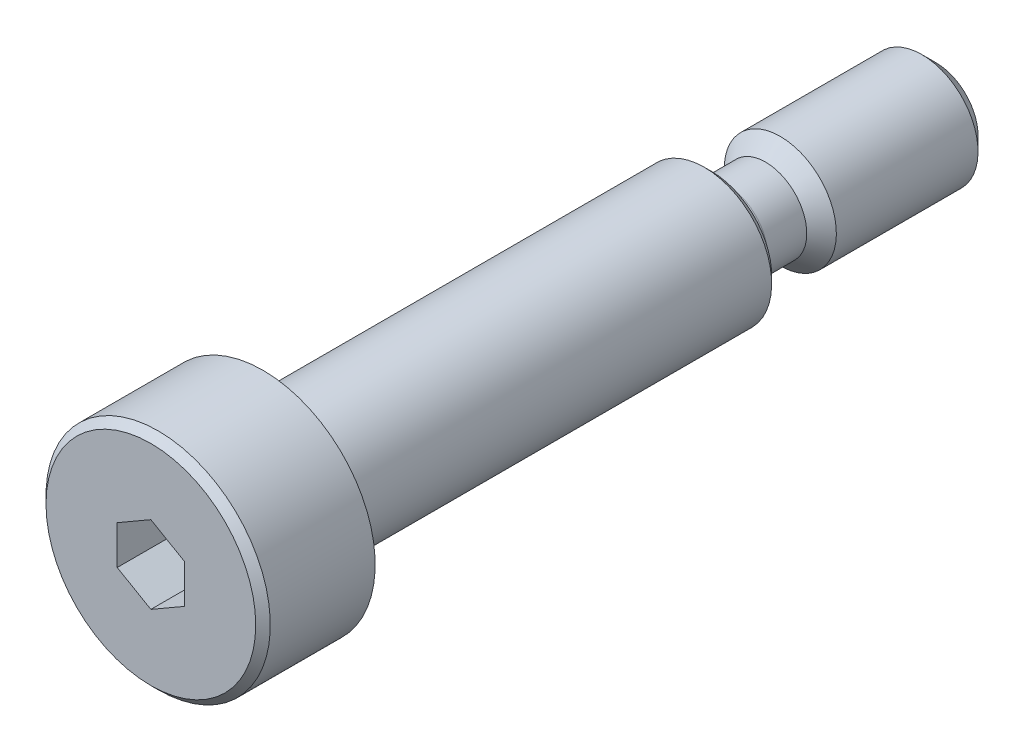
ISO-10303-21;
HEADER;
FILE_DESCRIPTION(('STEP AP214'),'2;1');
FILE_NAME('part.step','',(''),(''),'','','');
FILE_SCHEMA(('AUTOMOTIVE_DESIGN { 1 0 10303 214 1 1 1 1 }'));
ENDSEC;
DATA;
#1=APPLICATION_CONTEXT('core data for automotive mechanical design processes');
#2=APPLICATION_PROTOCOL_DEFINITION('international standard','automotive_design',2000,#1);
#3=PRODUCT_CONTEXT('',#1,'mechanical');
#4=PRODUCT('Part','Part','',(#3));
#5=PRODUCT_RELATED_PRODUCT_CATEGORY('part','',(#4));
#6=PRODUCT_DEFINITION_FORMATION('','',#4);
#7=PRODUCT_DEFINITION_CONTEXT('part definition',#1,'design');
#8=PRODUCT_DEFINITION('design','',#6,#7);
#9=PRODUCT_DEFINITION_SHAPE('','',#8);
#10=(LENGTH_UNIT() NAMED_UNIT(*) SI_UNIT(.MILLI.,.METRE.));
#11=(NAMED_UNIT(*) PLANE_ANGLE_UNIT() SI_UNIT($,.RADIAN.));
#12=(NAMED_UNIT(*) SI_UNIT($,.STERADIAN.) SOLID_ANGLE_UNIT());
#13=UNCERTAINTY_MEASURE_WITH_UNIT(LENGTH_MEASURE(1.E-05),#10,'distance_accuracy_value','');
#14=(GEOMETRIC_REPRESENTATION_CONTEXT(3) GLOBAL_UNCERTAINTY_ASSIGNED_CONTEXT((#13)) GLOBAL_UNIT_ASSIGNED_CONTEXT((#10,
#11,#12)) REPRESENTATION_CONTEXT('',''));
#15=CARTESIAN_POINT('',(0.,0.,0.));
#16=DIRECTION('',(0.,0.,1.));
#17=DIRECTION('',(1.,0.,0.));
#18=AXIS2_PLACEMENT_3D('',#15,#16,#17);
#19=CARTESIAN_POINT('',(0.,0.,-17.5));
#20=DIRECTION('',(0.,0.,-1.));
#21=DIRECTION('',(0.,1.,0.));
#22=AXIS2_PLACEMENT_3D('',#19,#20,#21);
#23=CYLINDRICAL_SURFACE('',#22,3.);
#24=CARTESIAN_POINT('',(0.,0.,-7.17500000000001));
#25=DIRECTION('',(0.,0.,-1.));
#26=DIRECTION('',(0.,1.,0.));
#27=AXIS2_PLACEMENT_3D('',#24,#25,#26);
#28=CIRCLE('',#27,3.);
#29=CARTESIAN_POINT('',(0.,3.,-7.17500000000001));
#30=VERTEX_POINT('',#29);
#31=EDGE_CURVE('E217',#30,#30,#28,.F.);
#32=ORIENTED_EDGE('',*,*,#31,.T.);
#33=EDGE_LOOP('',(#32));
#34=FACE_BOUND('',#33,.T.);
#35=CARTESIAN_POINT('',(0.,0.,11.6383333333333));
#36=DIRECTION('',(0.,0.,-1.));
#37=DIRECTION('',(0.,1.,0.));
#38=AXIS2_PLACEMENT_3D('',#35,#36,#37);
#39=CIRCLE('',#38,3.);
#40=CARTESIAN_POINT('',(0.,3.,11.6383333333333));
#41=VERTEX_POINT('',#40);
#42=EDGE_CURVE('E186',#41,#41,#39,.T.);
#43=ORIENTED_EDGE('',*,*,#42,.T.);
#44=EDGE_LOOP('',(#43));
#45=FACE_BOUND('',#44,.T.);
#46=ADVANCED_FACE('F41',(#34,#45),#23,.T.);
#47=CARTESIAN_POINT('',(0.,-3.,-7.5));
#48=DIRECTION('',(0.,0.,-1.));
#49=DIRECTION('',(0.,1.,0.));
#50=AXIS2_PLACEMENT_3D('',#47,#48,#49);
#51=PLANE('',#50);
#52=CARTESIAN_POINT('',(0.,0.,-7.5));
#53=DIRECTION('',(0.,0.,-1.));
#54=DIRECTION('',(0.,1.,0.));
#55=AXIS2_PLACEMENT_3D('',#52,#53,#54);
#56=CIRCLE('',#55,2.67500000000001);
#57=CARTESIAN_POINT('',(0.,2.67500000000001,-7.5));
#58=VERTEX_POINT('',#57);
#59=EDGE_CURVE('E213',#58,#58,#56,.T.);
#60=ORIENTED_EDGE('',*,*,#59,.T.);
#61=EDGE_LOOP('',(#60));
#62=FACE_BOUND('',#61,.T.);
#63=CARTESIAN_POINT('',(0.,0.,-7.5));
#64=DIRECTION('',(0.,0.,-1.));
#65=DIRECTION('',(0.,1.,0.));
#66=AXIS2_PLACEMENT_3D('',#63,#64,#65);
#67=CIRCLE('',#66,2.5);
#68=CARTESIAN_POINT('',(0.,2.5,-7.5));
#69=VERTEX_POINT('',#68);
#70=EDGE_CURVE('E173',#69,#69,#67,.T.);
#71=ORIENTED_EDGE('',*,*,#70,.F.);
#72=EDGE_LOOP('',(#71));
#73=FACE_BOUND('',#72,.T.);
#74=ADVANCED_FACE('F241',(#62,#73),#51,.T.);
#75=CARTESIAN_POINT('',(0.,0.,-17.5));
#76=DIRECTION('',(0.,0.,-1.));
#77=DIRECTION('',(0.,1.,0.));
#78=AXIS2_PLACEMENT_3D('',#75,#76,#77);
#79=CYLINDRICAL_SURFACE('',#78,2.33333333333333);
#80=CARTESIAN_POINT('',(0.,0.,12.0283333333333));
#81=DIRECTION('',(0.,0.,-1.));
#82=DIRECTION('',(0.,1.,0.));
#83=AXIS2_PLACEMENT_3D('',#80,#81,#82);
#84=CIRCLE('',#83,2.33333333333333);
#85=CARTESIAN_POINT('',(0.,2.33333333333333,12.0283333333333));
#86=VERTEX_POINT('',#85);
#87=EDGE_CURVE('E198',#86,#86,#84,.F.);
#88=ORIENTED_EDGE('',*,*,#87,.T.);
#89=EDGE_LOOP('',(#88));
#90=FACE_BOUND('',#89,.T.);
#91=CARTESIAN_POINT('',(0.,0.,12.5));
#92=DIRECTION('',(0.,0.,-1.));
#93=DIRECTION('',(0.,1.,0.));
#94=AXIS2_PLACEMENT_3D('',#91,#92,#93);
#95=CIRCLE('',#94,2.33333333333333);
#96=CARTESIAN_POINT('',(0.,2.33333333333333,12.5));
#97=VERTEX_POINT('',#96);
#98=EDGE_CURVE('E178',#97,#97,#95,.T.);
#99=ORIENTED_EDGE('',*,*,#98,.T.);
#100=EDGE_LOOP('',(#99));
#101=FACE_BOUND('',#100,.T.);
#102=ADVANCED_FACE('F247',(#90,#101),#79,.T.);
#103=CARTESIAN_POINT('',(0.,3.,11.8333333333333));
#104=DIRECTION('',(0.,0.,-1.));
#105=DIRECTION('',(0.,1.,0.));
#106=AXIS2_PLACEMENT_3D('',#103,#104,#105);
#107=PLANE('',#106);
#108=CARTESIAN_POINT('',(0.,0.,11.8333333333333));
#109=DIRECTION('',(0.,0.,-1.));
#110=DIRECTION('',(0.,1.,0.));
#111=AXIS2_PLACEMENT_3D('',#108,#109,#110);
#112=CIRCLE('',#111,2.805);
#113=CARTESIAN_POINT('',(0.,2.805,11.8333333333333));
#114=VERTEX_POINT('',#113);
#115=EDGE_CURVE('E194',#114,#114,#112,.F.);
#116=ORIENTED_EDGE('',*,*,#115,.T.);
#117=EDGE_LOOP('',(#116));
#118=FACE_BOUND('',#117,.T.);
#119=CARTESIAN_POINT('',(0.,0.,11.8333333333333));
#120=DIRECTION('',(0.,0.,-1.));
#121=DIRECTION('',(0.,1.,0.));
#122=AXIS2_PLACEMENT_3D('',#119,#120,#121);
#123=CIRCLE('',#122,2.52833333333334);
#124=CARTESIAN_POINT('',(0.,2.52833333333333,11.8333333333333));
#125=VERTEX_POINT('',#124);
#126=EDGE_CURVE('E190',#125,#125,#123,.T.);
#127=ORIENTED_EDGE('',*,*,#126,.T.);
#128=EDGE_LOOP('',(#127));
#129=FACE_BOUND('',#128,.T.);
#130=ADVANCED_FACE('F263',(#118,#129),#107,.F.);
#131=CARTESIAN_POINT('',(0.,0.,17.5));
#132=DIRECTION('',(0.,0.,1.));
#133=DIRECTION('',(0.,-1.,0.));
#134=AXIS2_PLACEMENT_3D('',#131,#132,#133);
#135=PLANE('',#134);
#136=DIRECTION('',(0.,1.,0.));
#137=VECTOR('',#136,1.);
#138=CARTESIAN_POINT('',(1.5,-0.866025403784444,17.5));
#139=LINE('',#138,#137);
#140=CARTESIAN_POINT('',(1.5,-0.866025403784444,17.5));
#141=VERTEX_POINT('',#140);
#142=CARTESIAN_POINT('',(1.5,0.866025403784433,17.5));
#143=VERTEX_POINT('',#142);
#144=EDGE_CURVE('E57',#141,#143,#139,.T.);
#145=ORIENTED_EDGE('',*,*,#144,.F.);
#146=DIRECTION('',(0.866025403784439,0.5,0.));
#147=VECTOR('',#146,1.);
#148=CARTESIAN_POINT('',(0.,-1.73205080756888,17.5));
#149=LINE('',#148,#147);
#150=CARTESIAN_POINT('',(0.,-1.73205080756888,17.5));
#151=VERTEX_POINT('',#150);
#152=EDGE_CURVE('E150',#151,#141,#149,.T.);
#153=ORIENTED_EDGE('',*,*,#152,.F.);
#154=DIRECTION('',(0.866025403784439,-0.5,0.));
#155=VECTOR('',#154,1.);
#156=CARTESIAN_POINT('',(-1.5,-0.866025403784444,17.5));
#157=LINE('',#156,#155);
#158=CARTESIAN_POINT('',(-1.5,-0.866025403784444,17.5));
#159=VERTEX_POINT('',#158);
#160=EDGE_CURVE('E147',#159,#151,#157,.T.);
#161=ORIENTED_EDGE('',*,*,#160,.F.);
#162=DIRECTION('',(0.,-1.,0.));
#163=VECTOR('',#162,1.);
#164=CARTESIAN_POINT('',(-1.5,0.866025403784433,17.5));
#165=LINE('',#164,#163);
#166=CARTESIAN_POINT('',(-1.5,0.866025403784433,17.5));
#167=VERTEX_POINT('',#166);
#168=EDGE_CURVE('E105',#167,#159,#165,.T.);
#169=ORIENTED_EDGE('',*,*,#168,.F.);
#170=DIRECTION('',(-0.866025403784439,-0.5,0.));
#171=VECTOR('',#170,1.);
#172=CARTESIAN_POINT('',(0.,1.73205080756887,17.5));
#173=LINE('',#172,#171);
#174=CARTESIAN_POINT('',(0.,1.73205080756887,17.5));
#175=VERTEX_POINT('',#174);
#176=EDGE_CURVE('E141',#175,#167,#173,.T.);
#177=ORIENTED_EDGE('',*,*,#176,.F.);
#178=DIRECTION('',(-0.866025403784439,0.5,0.));
#179=VECTOR('',#178,1.);
#180=CARTESIAN_POINT('',(1.5,0.866025403784434,17.5));
#181=LINE('',#180,#179);
#182=EDGE_CURVE('E137',#143,#175,#181,.T.);
#183=ORIENTED_EDGE('',*,*,#182,.F.);
#184=EDGE_LOOP('',(#145,#153,#161,#169,#177,#183));
#185=FACE_BOUND('',#184,.T.);
#186=CARTESIAN_POINT('',(0.,0.,17.5));
#187=DIRECTION('',(0.,0.,1.));
#188=DIRECTION('',(0.,-1.,0.));
#189=AXIS2_PLACEMENT_3D('',#186,#187,#188);
#190=CIRCLE('',#189,4.675);
#191=CARTESIAN_POINT('',(0.,-4.67500000000001,17.5));
#192=VERTEX_POINT('',#191);
#193=EDGE_CURVE('E11',#192,#192,#190,.T.);
#194=ORIENTED_EDGE('',*,*,#193,.T.);
#195=EDGE_LOOP('',(#194));
#196=FACE_BOUND('',#195,.T.);
#197=ADVANCED_FACE('F260',(#185,#196),#135,.T.);
#198=CARTESIAN_POINT('',(0.,0.,-17.5));
#199=DIRECTION('',(0.,0.,-1.));
#200=DIRECTION('',(0.,1.,0.));
#201=AXIS2_PLACEMENT_3D('',#198,#199,#200);
#202=CYLINDRICAL_SURFACE('',#201,5.);
#203=CARTESIAN_POINT('',(0.,0.,17.175));
#204=DIRECTION('',(0.,0.,1.));
#205=DIRECTION('',(0.,-1.,0.));
#206=AXIS2_PLACEMENT_3D('',#203,#204,#205);
#207=CIRCLE('',#206,5.);
#208=CARTESIAN_POINT('',(0.,-5.,17.175));
#209=VERTEX_POINT('',#208);
#210=EDGE_CURVE('E50',#209,#209,#207,.F.);
#211=ORIENTED_EDGE('',*,*,#210,.T.);
#212=EDGE_LOOP('',(#211));
#213=FACE_BOUND('',#212,.T.);
#214=CARTESIAN_POINT('',(0.,0.,12.5));
#215=DIRECTION('',(0.,0.,-1.));
#216=DIRECTION('',(0.,1.,0.));
#217=AXIS2_PLACEMENT_3D('',#214,#215,#216);
#218=CIRCLE('',#217,5.);
#219=CARTESIAN_POINT('',(0.,5.,12.5));
#220=VERTEX_POINT('',#219);
#221=EDGE_CURVE('E182',#220,#220,#218,.T.);
#222=ORIENTED_EDGE('',*,*,#221,.F.);
#223=EDGE_LOOP('',(#222));
#224=FACE_BOUND('',#223,.T.);
#225=ADVANCED_FACE('F224',(#213,#224),#202,.T.);
#226=CARTESIAN_POINT('',(0.,-5.,12.5));
#227=DIRECTION('',(0.,0.,-1.));
#228=DIRECTION('',(0.,1.,0.));
#229=AXIS2_PLACEMENT_3D('',#226,#227,#228);
#230=PLANE('',#229);
#231=ORIENTED_EDGE('',*,*,#221,.T.);
#232=EDGE_LOOP('',(#231));
#233=FACE_BOUND('',#232,.T.);
#234=ORIENTED_EDGE('',*,*,#98,.F.);
#235=EDGE_LOOP('',(#234));
#236=FACE_BOUND('',#235,.T.);
#237=ADVANCED_FACE('F253',(#233,#236),#230,.T.);
#238=CARTESIAN_POINT('',(0.,0.,11.6383333333333));
#239=DIRECTION('',(0.,0.,-1.));
#240=DIRECTION('',(0.,1.,0.));
#241=AXIS2_PLACEMENT_3D('',#238,#239,#240);
#242=CONICAL_SURFACE('',#241,3.,0.785398163397448);
#243=ORIENTED_EDGE('',*,*,#115,.F.);
#244=EDGE_LOOP('',(#243));
#245=FACE_BOUND('',#244,.T.);
#246=ORIENTED_EDGE('',*,*,#42,.F.);
#247=EDGE_LOOP('',(#246));
#248=FACE_BOUND('',#247,.T.);
#249=ADVANCED_FACE('F256',(#245,#248),#242,.T.);
#250=CARTESIAN_POINT('',(0.,0.,11.8333333333333));
#251=DIRECTION('',(0.,0.,-1.));
#252=DIRECTION('',(0.,1.,0.));
#253=AXIS2_PLACEMENT_3D('',#250,#251,#252);
#254=CONICAL_SURFACE('',#253,2.52833333333334,0.785398163397449);
#255=ORIENTED_EDGE('',*,*,#87,.F.);
#256=EDGE_LOOP('',(#255));
#257=FACE_BOUND('',#256,.T.);
#258=ORIENTED_EDGE('',*,*,#126,.F.);
#259=EDGE_LOOP('',(#258));
#260=FACE_BOUND('',#259,.T.);
#261=ADVANCED_FACE('F267',(#257,#260),#254,.T.);
#262=CARTESIAN_POINT('',(0.,0.,-8.16000000000001));
#263=DIRECTION('',(0.,0.,-1.));
#264=DIRECTION('',(0.,1.,0.));
#265=AXIS2_PLACEMENT_3D('',#262,#263,#264);
#266=TOROIDAL_SURFACE('',#265,2.5,0.660000000000006);
#267=CARTESIAN_POINT('',(0.,0.,-8.16));
#268=DIRECTION('',(0.,0.,-1.));
#269=DIRECTION('',(0.,1.,0.));
#270=AXIS2_PLACEMENT_3D('',#267,#268,#269);
#271=CIRCLE('',#270,1.84);
#272=CARTESIAN_POINT('',(0.,1.84,-8.16));
#273=VERTEX_POINT('',#272);
#274=EDGE_CURVE('E169',#273,#273,#271,.T.);
#275=ORIENTED_EDGE('',*,*,#274,.F.);
#276=EDGE_LOOP('',(#275));
#277=FACE_BOUND('',#276,.T.);
#278=ORIENTED_EDGE('',*,*,#70,.T.);
#279=EDGE_LOOP('',(#278));
#280=FACE_BOUND('',#279,.T.);
#281=ADVANCED_FACE('F271',(#277,#280),#266,.F.);
#282=CARTESIAN_POINT('',(0.,0.,-17.5));
#283=DIRECTION('',(0.,0.,-1.));
#284=DIRECTION('',(0.,1.,0.));
#285=AXIS2_PLACEMENT_3D('',#282,#283,#284);
#286=CYLINDRICAL_SURFACE('',#285,1.84);
#287=CARTESIAN_POINT('',(0.,0.,-9.9));
#288=DIRECTION('',(0.,0.,-1.));
#289=DIRECTION('',(0.,1.,0.));
#290=AXIS2_PLACEMENT_3D('',#287,#288,#289);
#291=CIRCLE('',#290,1.84);
#292=CARTESIAN_POINT('',(0.,1.84,-9.9));
#293=VERTEX_POINT('',#292);
#294=EDGE_CURVE('E156',#293,#293,#291,.T.);
#295=ORIENTED_EDGE('',*,*,#294,.F.);
#296=EDGE_LOOP('',(#295));
#297=FACE_BOUND('',#296,.T.);
#298=ORIENTED_EDGE('',*,*,#274,.T.);
#299=EDGE_LOOP('',(#298));
#300=FACE_BOUND('',#299,.T.);
#301=ADVANCED_FACE('F291',(#297,#300),#286,.T.);
#302=CARTESIAN_POINT('',(0.,0.,-9.9));
#303=DIRECTION('',(0.,0.,-1.));
#304=DIRECTION('',(0.,1.,0.));
#305=AXIS2_PLACEMENT_3D('',#302,#303,#304);
#306=CONICAL_SURFACE('',#305,1.84,0.785398163397443);
#307=CARTESIAN_POINT('',(0.,0.,-10.56));
#308=DIRECTION('',(0.,0.,-1.));
#309=DIRECTION('',(0.,1.,0.));
#310=AXIS2_PLACEMENT_3D('',#307,#308,#309);
#311=CIRCLE('',#310,2.5);
#312=CARTESIAN_POINT('',(0.,2.5,-10.56));
#313=VERTEX_POINT('',#312);
#314=EDGE_CURVE('E177',#313,#313,#311,.F.);
#315=ORIENTED_EDGE('',*,*,#314,.T.);
#316=EDGE_LOOP('',(#315));
#317=FACE_BOUND('',#316,.T.);
#318=ORIENTED_EDGE('',*,*,#294,.T.);
#319=EDGE_LOOP('',(#318));
#320=FACE_BOUND('',#319,.T.);
#321=ADVANCED_FACE('F286',(#317,#320),#306,.T.);
#322=CARTESIAN_POINT('',(0.,-2.5,-17.5));
#323=DIRECTION('',(0.,0.,-1.));
#324=DIRECTION('',(0.,1.,0.));
#325=AXIS2_PLACEMENT_3D('',#322,#323,#324);
#326=PLANE('',#325);
#327=CARTESIAN_POINT('',(0.,0.,-17.5));
#328=DIRECTION('',(0.,0.,-1.));
#329=DIRECTION('',(0.,1.,0.));
#330=AXIS2_PLACEMENT_3D('',#327,#328,#329);
#331=CIRCLE('',#330,1.875);
#332=CARTESIAN_POINT('',(0.,1.87500000000001,-17.5));
#333=VERTEX_POINT('',#332);
#334=EDGE_CURVE('E202',#333,#333,#331,.T.);
#335=ORIENTED_EDGE('',*,*,#334,.T.);
#336=EDGE_LOOP('',(#335));
#337=FACE_BOUND('',#336,.T.);
#338=ADVANCED_FACE('F279',(#337),#326,.T.);
#339=CARTESIAN_POINT('',(0.,0.,-17.5));
#340=DIRECTION('',(0.,0.,-1.));
#341=DIRECTION('',(0.,1.,0.));
#342=AXIS2_PLACEMENT_3D('',#339,#340,#341);
#343=CYLINDRICAL_SURFACE('',#342,2.5);
#344=CARTESIAN_POINT('',(0.,0.,-16.875));
#345=DIRECTION('',(0.,0.,-1.));
#346=DIRECTION('',(0.,1.,0.));
#347=AXIS2_PLACEMENT_3D('',#344,#345,#346);
#348=CIRCLE('',#347,2.5);
#349=CARTESIAN_POINT('',(0.,2.5,-16.875));
#350=VERTEX_POINT('',#349);
#351=EDGE_CURVE('E209',#350,#350,#348,.F.);
#352=ORIENTED_EDGE('',*,*,#351,.T.);
#353=EDGE_LOOP('',(#352));
#354=FACE_BOUND('',#353,.T.);
#355=ORIENTED_EDGE('',*,*,#314,.F.);
#356=EDGE_LOOP('',(#355));
#357=FACE_BOUND('',#356,.T.);
#358=ADVANCED_FACE('F274',(#354,#357),#343,.T.);
#359=CARTESIAN_POINT('',(0.,0.,-17.5));
#360=DIRECTION('',(0.,0.,1.));
#361=DIRECTION('',(0.,-1.,0.));
#362=AXIS2_PLACEMENT_3D('',#359,#360,#361);
#363=CONICAL_SURFACE('',#362,1.875,0.785398163397446);
#364=ORIENTED_EDGE('',*,*,#351,.F.);
#365=EDGE_LOOP('',(#364));
#366=FACE_BOUND('',#365,.T.);
#367=ORIENTED_EDGE('',*,*,#334,.F.);
#368=EDGE_LOOP('',(#367));
#369=FACE_BOUND('',#368,.T.);
#370=ADVANCED_FACE('F237',(#366,#369),#363,.T.);
#371=CARTESIAN_POINT('',(0.,0.,-7.5));
#372=DIRECTION('',(0.,0.,1.));
#373=DIRECTION('',(0.,-1.,0.));
#374=AXIS2_PLACEMENT_3D('',#371,#372,#373);
#375=CONICAL_SURFACE('',#374,2.67500000000001,0.785398163397445);
#376=ORIENTED_EDGE('',*,*,#31,.F.);
#377=EDGE_LOOP('',(#376));
#378=FACE_BOUND('',#377,.T.);
#379=ORIENTED_EDGE('',*,*,#59,.F.);
#380=EDGE_LOOP('',(#379));
#381=FACE_BOUND('',#380,.T.);
#382=ADVANCED_FACE('F229',(#378,#381),#375,.T.);
#383=CARTESIAN_POINT('',(0.,0.,17.175));
#384=DIRECTION('',(0.,0.,-1.));
#385=DIRECTION('',(0.,1.,0.));
#386=AXIS2_PLACEMENT_3D('',#383,#384,#385);
#387=CONICAL_SURFACE('',#386,5.,0.785398163397455);
#388=ORIENTED_EDGE('',*,*,#193,.F.);
#389=EDGE_LOOP('',(#388));
#390=FACE_BOUND('',#389,.T.);
#391=ORIENTED_EDGE('',*,*,#210,.F.);
#392=EDGE_LOOP('',(#391));
#393=FACE_BOUND('',#392,.T.);
#394=ADVANCED_FACE('F43',(#390,#393),#387,.T.);
#395=CARTESIAN_POINT('',(1.5,-0.866025403784444,15.));
#396=DIRECTION('',(1.,0.,0.));
#397=DIRECTION('',(0.,1.,0.));
#398=AXIS2_PLACEMENT_3D('',#395,#396,#397);
#399=PLANE('',#398);
#400=ORIENTED_EDGE('',*,*,#144,.T.);
#401=DIRECTION('',(0.,0.,1.));
#402=VECTOR('',#401,1.);
#403=CARTESIAN_POINT('',(1.5,0.866025403784434,15.));
#404=LINE('',#403,#402);
#405=CARTESIAN_POINT('',(1.5,0.866025403784434,15.));
#406=VERTEX_POINT('',#405);
#407=EDGE_CURVE('E87',#406,#143,#404,.T.);
#408=ORIENTED_EDGE('',*,*,#407,.F.);
#409=DIRECTION('',(0.,1.,0.));
#410=VECTOR('',#409,1.);
#411=CARTESIAN_POINT('',(1.5,-0.866025403784444,15.));
#412=LINE('',#411,#410);
#413=CARTESIAN_POINT('',(1.5,-0.866025403784444,15.));
#414=VERTEX_POINT('',#413);
#415=EDGE_CURVE('E153',#414,#406,#412,.T.);
#416=ORIENTED_EDGE('',*,*,#415,.F.);
#417=DIRECTION('',(0.,0.,1.));
#418=VECTOR('',#417,1.);
#419=CARTESIAN_POINT('',(1.5,-0.866025403784444,15.));
#420=LINE('',#419,#418);
#421=EDGE_CURVE('E65',#414,#141,#420,.T.);
#422=ORIENTED_EDGE('',*,*,#421,.T.);
#423=EDGE_LOOP('',(#400,#408,#416,#422));
#424=FACE_BOUND('',#423,.T.);
#425=ADVANCED_FACE('F228',(#424),#399,.F.);
#426=CARTESIAN_POINT('',(0.,-1.73205080756888,15.));
#427=DIRECTION('',(0.5,-0.866025403784439,0.));
#428=DIRECTION('',(0.866025403784439,0.5,0.));
#429=AXIS2_PLACEMENT_3D('',#426,#427,#428);
#430=PLANE('',#429);
#431=ORIENTED_EDGE('',*,*,#152,.T.);
#432=ORIENTED_EDGE('',*,*,#421,.F.);
#433=DIRECTION('',(0.866025403784439,0.5,0.));
#434=VECTOR('',#433,1.);
#435=CARTESIAN_POINT('',(0.,-1.73205080756888,15.));
#436=LINE('',#435,#434);
#437=CARTESIAN_POINT('',(0.,-1.73205080756888,15.));
#438=VERTEX_POINT('',#437);
#439=EDGE_CURVE('E119',#438,#414,#436,.T.);
#440=ORIENTED_EDGE('',*,*,#439,.F.);
#441=DIRECTION('',(0.,0.,1.));
#442=VECTOR('',#441,1.);
#443=CARTESIAN_POINT('',(0.,-1.73205080756888,15.));
#444=LINE('',#443,#442);
#445=EDGE_CURVE('E110',#438,#151,#444,.T.);
#446=ORIENTED_EDGE('',*,*,#445,.T.);
#447=EDGE_LOOP('',(#431,#432,#440,#446));
#448=FACE_BOUND('',#447,.T.);
#449=ADVANCED_FACE('F235',(#448),#430,.F.);
#450=CARTESIAN_POINT('',(-1.5,-0.866025403784444,15.));
#451=DIRECTION('',(-0.5,-0.866025403784438,0.));
#452=DIRECTION('',(0.866025403784439,-0.5,0.));
#453=AXIS2_PLACEMENT_3D('',#450,#451,#452);
#454=PLANE('',#453);
#455=ORIENTED_EDGE('',*,*,#160,.T.);
#456=ORIENTED_EDGE('',*,*,#445,.F.);
#457=DIRECTION('',(0.866025403784439,-0.5,0.));
#458=VECTOR('',#457,1.);
#459=CARTESIAN_POINT('',(-1.5,-0.866025403784444,15.));
#460=LINE('',#459,#458);
#461=CARTESIAN_POINT('',(-1.5,-0.866025403784444,15.));
#462=VERTEX_POINT('',#461);
#463=EDGE_CURVE('E114',#462,#438,#460,.T.);
#464=ORIENTED_EDGE('',*,*,#463,.F.);
#465=DIRECTION('',(0.,0.,1.));
#466=VECTOR('',#465,1.);
#467=CARTESIAN_POINT('',(-1.5,-0.866025403784444,15.));
#468=LINE('',#467,#466);
#469=EDGE_CURVE('E98',#462,#159,#468,.T.);
#470=ORIENTED_EDGE('',*,*,#469,.T.);
#471=EDGE_LOOP('',(#455,#456,#464,#470));
#472=FACE_BOUND('',#471,.T.);
#473=ADVANCED_FACE('F115',(#472),#454,.F.);
#474=CARTESIAN_POINT('',(-1.5,0.866025403784433,15.));
#475=DIRECTION('',(-1.,0.,0.));
#476=DIRECTION('',(0.,0.,1.));
#477=AXIS2_PLACEMENT_3D('',#474,#475,#476);
#478=PLANE('',#477);
#479=ORIENTED_EDGE('',*,*,#168,.T.);
#480=ORIENTED_EDGE('',*,*,#469,.F.);
#481=DIRECTION('',(0.,-1.,0.));
#482=VECTOR('',#481,1.);
#483=CARTESIAN_POINT('',(-1.5,0.866025403784433,15.));
#484=LINE('',#483,#482);
#485=CARTESIAN_POINT('',(-1.5,0.866025403784433,15.));
#486=VERTEX_POINT('',#485);
#487=EDGE_CURVE('E102',#486,#462,#484,.T.);
#488=ORIENTED_EDGE('',*,*,#487,.F.);
#489=DIRECTION('',(0.,0.,1.));
#490=VECTOR('',#489,1.);
#491=CARTESIAN_POINT('',(-1.5,0.866025403784433,15.));
#492=LINE('',#491,#490);
#493=EDGE_CURVE('E111',#486,#167,#492,.T.);
#494=ORIENTED_EDGE('',*,*,#493,.T.);
#495=EDGE_LOOP('',(#479,#480,#488,#494));
#496=FACE_BOUND('',#495,.T.);
#497=ADVANCED_FACE('F100',(#496),#478,.F.);
#498=CARTESIAN_POINT('',(0.,1.73205080756887,15.));
#499=DIRECTION('',(-0.5,0.866025403784439,0.));
#500=DIRECTION('',(-0.866025403784439,-0.5,0.));
#501=AXIS2_PLACEMENT_3D('',#498,#499,#500);
#502=PLANE('',#501);
#503=ORIENTED_EDGE('',*,*,#176,.T.);
#504=ORIENTED_EDGE('',*,*,#493,.F.);
#505=DIRECTION('',(-0.866025403784439,-0.5,0.));
#506=VECTOR('',#505,1.);
#507=CARTESIAN_POINT('',(0.,1.73205080756887,15.));
#508=LINE('',#507,#506);
#509=CARTESIAN_POINT('',(0.,1.73205080756887,15.));
#510=VERTEX_POINT('',#509);
#511=EDGE_CURVE('E125',#510,#486,#508,.T.);
#512=ORIENTED_EDGE('',*,*,#511,.F.);
#513=DIRECTION('',(0.,0.,1.));
#514=VECTOR('',#513,1.);
#515=CARTESIAN_POINT('',(0.,1.73205080756887,15.));
#516=LINE('',#515,#514);
#517=EDGE_CURVE('E161',#510,#175,#516,.T.);
#518=ORIENTED_EDGE('',*,*,#517,.T.);
#519=EDGE_LOOP('',(#503,#504,#512,#518));
#520=FACE_BOUND('',#519,.T.);
#521=ADVANCED_FACE('F310',(#520),#502,.F.);
#522=CARTESIAN_POINT('',(1.5,0.866025403784434,15.));
#523=DIRECTION('',(0.5,0.866025403784439,0.));
#524=DIRECTION('',(-0.866025403784439,0.5,0.));
#525=AXIS2_PLACEMENT_3D('',#522,#523,#524);
#526=PLANE('',#525);
#527=ORIENTED_EDGE('',*,*,#182,.T.);
#528=ORIENTED_EDGE('',*,*,#517,.F.);
#529=DIRECTION('',(-0.866025403784439,0.5,0.));
#530=VECTOR('',#529,1.);
#531=CARTESIAN_POINT('',(1.5,0.866025403784434,15.));
#532=LINE('',#531,#530);
#533=EDGE_CURVE('E129',#406,#510,#532,.T.);
#534=ORIENTED_EDGE('',*,*,#533,.F.);
#535=ORIENTED_EDGE('',*,*,#407,.T.);
#536=EDGE_LOOP('',(#527,#528,#534,#535));
#537=FACE_BOUND('',#536,.T.);
#538=ADVANCED_FACE('F307',(#537),#526,.F.);
#539=CARTESIAN_POINT('',(0.,0.,15.));
#540=DIRECTION('',(0.,0.,1.));
#541=DIRECTION('',(1.,0.,0.));
#542=AXIS2_PLACEMENT_3D('',#539,#540,#541);
#543=PLANE('',#542);
#544=ORIENTED_EDGE('',*,*,#415,.T.);
#545=ORIENTED_EDGE('',*,*,#533,.T.);
#546=ORIENTED_EDGE('',*,*,#511,.T.);
#547=ORIENTED_EDGE('',*,*,#487,.T.);
#548=ORIENTED_EDGE('',*,*,#463,.T.);
#549=ORIENTED_EDGE('',*,*,#439,.T.);
#550=EDGE_LOOP('',(#544,#545,#546,#547,#548,#549));
#551=FACE_BOUND('',#550,.T.);
#552=ADVANCED_FACE('F122',(#551),#543,.T.);
#553=CLOSED_SHELL('',(#46,#74,#102,#130,#197,#225,#237,#249,#261,#281,#301,#321,#338,#358,#370,
#382,#394,#425,#449,#473,#497,#521,#538,#552));
#554=MANIFOLD_SOLID_BREP('B2',#553);
#555=ADVANCED_BREP_SHAPE_REPRESENTATION('',(#18,#554),#14);
#556=SHAPE_DEFINITION_REPRESENTATION(#9,#555);
ENDSEC;
END-ISO-10303-21;
